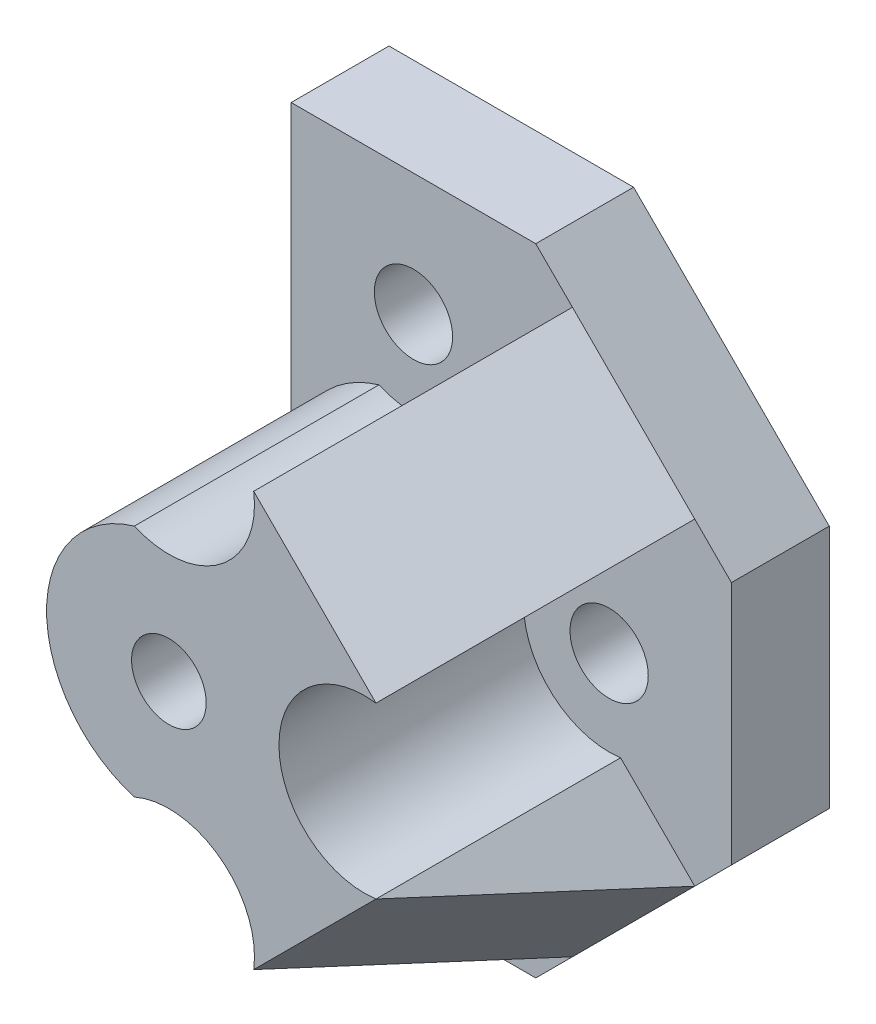
ISO-10303-21;
HEADER;
FILE_DESCRIPTION(('STEP AP214'),'2;1');
FILE_NAME('part.step','',(''),(''),'','','');
FILE_SCHEMA(('AUTOMOTIVE_DESIGN { 1 0 10303 214 1 1 1 1 }'));
ENDSEC;
DATA;
#1=APPLICATION_CONTEXT('core data for automotive mechanical design processes');
#2=APPLICATION_PROTOCOL_DEFINITION('international standard','automotive_design',2000,#1);
#3=PRODUCT_CONTEXT('',#1,'mechanical');
#4=PRODUCT('Part','Part','',(#3));
#5=PRODUCT_RELATED_PRODUCT_CATEGORY('part','',(#4));
#6=PRODUCT_DEFINITION_FORMATION('','',#4);
#7=PRODUCT_DEFINITION_CONTEXT('part definition',#1,'design');
#8=PRODUCT_DEFINITION('design','',#6,#7);
#9=PRODUCT_DEFINITION_SHAPE('','',#8);
#10=(LENGTH_UNIT() NAMED_UNIT(*) SI_UNIT(.MILLI.,.METRE.));
#11=(NAMED_UNIT(*) PLANE_ANGLE_UNIT() SI_UNIT($,.RADIAN.));
#12=(NAMED_UNIT(*) SI_UNIT($,.STERADIAN.) SOLID_ANGLE_UNIT());
#13=UNCERTAINTY_MEASURE_WITH_UNIT(LENGTH_MEASURE(1.E-05),#10,'distance_accuracy_value','');
#14=(GEOMETRIC_REPRESENTATION_CONTEXT(3) GLOBAL_UNCERTAINTY_ASSIGNED_CONTEXT((#13)) GLOBAL_UNIT_ASSIGNED_CONTEXT((#10,
#11,#12)) REPRESENTATION_CONTEXT('',''));
#15=CARTESIAN_POINT('',(0.,0.,0.));
#16=DIRECTION('',(0.,0.,1.));
#17=DIRECTION('',(1.,0.,0.));
#18=AXIS2_PLACEMENT_3D('',#15,#16,#17);
#19=CARTESIAN_POINT('',(0.,0.,4.));
#20=DIRECTION('',(0.,0.,-1.));
#21=DIRECTION('',(-1.,0.,0.));
#22=AXIS2_PLACEMENT_3D('',#19,#20,#21);
#23=PLANE('',#22);
#24=CARTESIAN_POINT('',(5.,5.,4.));
#25=DIRECTION('',(0.,0.,1.));
#26=DIRECTION('',(1.,0.,0.));
#27=AXIS2_PLACEMENT_3D('',#24,#25,#26);
#28=CIRCLE('',#27,1.6);
#29=CARTESIAN_POINT('',(6.6,5.,4.));
#30=VERTEX_POINT('',#29);
#31=EDGE_CURVE('E229',#30,#30,#28,.T.);
#32=ORIENTED_EDGE('',*,*,#31,.F.);
#33=EDGE_LOOP('',(#32));
#34=FACE_BOUND('',#33,.T.);
#35=DIRECTION('',(0.707106781186548,-0.707106781186547,0.));
#36=VECTOR('',#35,1.);
#37=CARTESIAN_POINT('',(8.46850196850295,4.53149803149705,4.));
#38=LINE('',#37,#36);
#39=CARTESIAN_POINT('',(8.46850196850295,4.53149803149705,4.));
#40=VERTEX_POINT('',#39);
#41=CARTESIAN_POINT('',(11.5,1.5,4.));
#42=VERTEX_POINT('',#41);
#43=EDGE_CURVE('E53',#40,#42,#38,.T.);
#44=ORIENTED_EDGE('',*,*,#43,.F.);
#45=CARTESIAN_POINT('',(5.,5.,4.));
#46=DIRECTION('',(0.,0.,-1.));
#47=DIRECTION('',(1.,0.,0.));
#48=AXIS2_PLACEMENT_3D('',#45,#46,#47);
#49=CIRCLE('',#48,3.5);
#50=CARTESIAN_POINT('',(3.58932986337166,8.203125,4.));
#51=VERTEX_POINT('',#50);
#52=EDGE_CURVE('E57',#51,#40,#49,.T.);
#53=ORIENTED_EDGE('',*,*,#52,.F.);
#54=CARTESIAN_POINT('',(5.,13.,4.));
#55=DIRECTION('',(0.,0.,1.));
#56=DIRECTION('',(1.,0.,0.));
#57=AXIS2_PLACEMENT_3D('',#54,#55,#56);
#58=CIRCLE('',#57,5.);
#59=CARTESIAN_POINT('',(0.,13.,4.));
#60=VERTEX_POINT('',#59);
#61=EDGE_CURVE('E11',#60,#51,#58,.T.);
#62=ORIENTED_EDGE('',*,*,#61,.F.);
#63=DIRECTION('',(0.,-1.,0.));
#64=VECTOR('',#63,1.);
#65=CARTESIAN_POINT('',(0.,0.,4.));
#66=LINE('',#65,#64);
#67=CARTESIAN_POINT('',(0.,0.,4.));
#68=VERTEX_POINT('',#67);
#69=EDGE_CURVE('E290',#60,#68,#66,.T.);
#70=ORIENTED_EDGE('',*,*,#69,.T.);
#71=DIRECTION('',(1.,0.,0.));
#72=VECTOR('',#71,1.);
#73=CARTESIAN_POINT('',(10.,0.,4.));
#74=LINE('',#73,#72);
#75=CARTESIAN_POINT('',(10.,0.,4.));
#76=VERTEX_POINT('',#75);
#77=EDGE_CURVE('E246',#68,#76,#74,.T.);
#78=ORIENTED_EDGE('',*,*,#77,.T.);
#79=DIRECTION('',(0.707106781186548,0.707106781186548,0.));
#80=VECTOR('',#79,1.);
#81=CARTESIAN_POINT('',(10.,0.,4.));
#82=LINE('',#81,#80);
#83=EDGE_CURVE('E257',#76,#42,#82,.T.);
#84=ORIENTED_EDGE('',*,*,#83,.T.);
#85=EDGE_LOOP('',(#44,#53,#62,#70,#78,#84));
#86=FACE_BOUND('',#85,.T.);
#87=ADVANCED_FACE('F35',(#34,#86),#23,.F.);
#88=CARTESIAN_POINT('',(5.,21.,4.));
#89=DIRECTION('',(0.,0.,1.));
#90=DIRECTION('',(1.,0.,0.));
#91=AXIS2_PLACEMENT_3D('',#88,#89,#90);
#92=CIRCLE('',#91,1.6);
#93=CARTESIAN_POINT('',(6.6,21.,4.));
#94=VERTEX_POINT('',#93);
#95=EDGE_CURVE('E240',#94,#94,#92,.T.);
#96=ORIENTED_EDGE('',*,*,#95,.F.);
#97=EDGE_LOOP('',(#96));
#98=FACE_BOUND('',#97,.T.);
#99=CARTESIAN_POINT('',(3.58932986337167,17.796875,4.));
#100=VERTEX_POINT('',#99);
#101=EDGE_CURVE('E46',#100,#60,#58,.T.);
#102=ORIENTED_EDGE('',*,*,#101,.F.);
#103=CARTESIAN_POINT('',(5.,21.,4.));
#104=DIRECTION('',(0.,0.,-1.));
#105=DIRECTION('',(1.,0.,0.));
#106=AXIS2_PLACEMENT_3D('',#103,#104,#105);
#107=CIRCLE('',#106,3.5);
#108=CARTESIAN_POINT('',(8.46850196850295,21.468501968503,4.));
#109=VERTEX_POINT('',#108);
#110=EDGE_CURVE('E192',#109,#100,#107,.T.);
#111=ORIENTED_EDGE('',*,*,#110,.F.);
#112=DIRECTION('',(-0.707106781186548,-0.707106781186547,0.));
#113=VECTOR('',#112,1.);
#114=CARTESIAN_POINT('',(11.5,24.5,4.));
#115=LINE('',#114,#113);
#116=CARTESIAN_POINT('',(11.5,24.5,4.));
#117=VERTEX_POINT('',#116);
#118=EDGE_CURVE('E196',#117,#109,#115,.T.);
#119=ORIENTED_EDGE('',*,*,#118,.F.);
#120=DIRECTION('',(-0.707106781186548,0.707106781186548,0.));
#121=VECTOR('',#120,1.);
#122=CARTESIAN_POINT('',(18.,18.,4.));
#123=LINE('',#122,#121);
#124=CARTESIAN_POINT('',(10.,26.,4.));
#125=VERTEX_POINT('',#124);
#126=EDGE_CURVE('E197',#117,#125,#123,.T.);
#127=ORIENTED_EDGE('',*,*,#126,.T.);
#128=DIRECTION('',(-1.,0.,0.));
#129=VECTOR('',#128,1.);
#130=CARTESIAN_POINT('',(0.,26.,4.));
#131=LINE('',#130,#129);
#132=CARTESIAN_POINT('',(0.,26.,4.));
#133=VERTEX_POINT('',#132);
#134=EDGE_CURVE('E291',#125,#133,#131,.T.);
#135=ORIENTED_EDGE('',*,*,#134,.T.);
#136=EDGE_CURVE('E276',#133,#60,#66,.T.);
#137=ORIENTED_EDGE('',*,*,#136,.T.);
#138=EDGE_LOOP('',(#102,#111,#119,#127,#135,#137));
#139=FACE_BOUND('',#138,.T.);
#140=ADVANCED_FACE('F349',(#98,#139),#23,.F.);
#141=CARTESIAN_POINT('',(13.,13.,4.));
#142=DIRECTION('',(0.,0.,1.));
#143=DIRECTION('',(1.,0.,0.));
#144=AXIS2_PLACEMENT_3D('',#141,#142,#143);
#145=CIRCLE('',#144,1.6);
#146=CARTESIAN_POINT('',(14.6,13.,4.));
#147=VERTEX_POINT('',#146);
#148=EDGE_CURVE('E222',#147,#147,#145,.T.);
#149=ORIENTED_EDGE('',*,*,#148,.F.);
#150=EDGE_LOOP('',(#149));
#151=FACE_BOUND('',#150,.T.);
#152=DIRECTION('',(-0.707106781186547,0.707106781186547,0.));
#153=VECTOR('',#152,1.);
#154=CARTESIAN_POINT('',(16.5,6.50000000000001,4.));
#155=LINE('',#154,#153);
#156=CARTESIAN_POINT('',(16.5,6.50000000000001,4.));
#157=VERTEX_POINT('',#156);
#158=CARTESIAN_POINT('',(13.468501968503,9.53149803149705,4.));
#159=VERTEX_POINT('',#158);
#160=EDGE_CURVE('E167',#157,#159,#155,.T.);
#161=ORIENTED_EDGE('',*,*,#160,.F.);
#162=CARTESIAN_POINT('',(18.,8.,4.));
#163=VERTEX_POINT('',#162);
#164=EDGE_CURVE('E249',#157,#163,#82,.T.);
#165=ORIENTED_EDGE('',*,*,#164,.T.);
#166=DIRECTION('',(0.,1.,0.));
#167=VECTOR('',#166,1.);
#168=CARTESIAN_POINT('',(18.,18.,4.));
#169=LINE('',#168,#167);
#170=CARTESIAN_POINT('',(18.,18.,4.));
#171=VERTEX_POINT('',#170);
#172=EDGE_CURVE('E253',#163,#171,#169,.T.);
#173=ORIENTED_EDGE('',*,*,#172,.T.);
#174=CARTESIAN_POINT('',(16.5,19.5,4.));
#175=VERTEX_POINT('',#174);
#176=EDGE_CURVE('E292',#171,#175,#123,.T.);
#177=ORIENTED_EDGE('',*,*,#176,.T.);
#178=DIRECTION('',(0.707106781186548,0.707106781186548,0.));
#179=VECTOR('',#178,1.);
#180=CARTESIAN_POINT('',(13.468501968503,16.468501968503,4.));
#181=LINE('',#180,#179);
#182=CARTESIAN_POINT('',(13.468501968503,16.468501968503,4.));
#183=VERTEX_POINT('',#182);
#184=EDGE_CURVE('E188',#183,#175,#181,.T.);
#185=ORIENTED_EDGE('',*,*,#184,.F.);
#186=CARTESIAN_POINT('',(13.,13.,4.));
#187=DIRECTION('',(0.,0.,-1.));
#188=DIRECTION('',(1.,0.,0.));
#189=AXIS2_PLACEMENT_3D('',#186,#187,#188);
#190=CIRCLE('',#189,3.5);
#191=EDGE_CURVE('E186',#159,#183,#190,.T.);
#192=ORIENTED_EDGE('',*,*,#191,.F.);
#193=EDGE_LOOP('',(#161,#165,#173,#177,#185,#192));
#194=FACE_BOUND('',#193,.T.);
#195=ADVANCED_FACE('F304',(#151,#194),#23,.F.);
#196=CARTESIAN_POINT('',(0.,0.,0.));
#197=DIRECTION('',(0.,0.,-1.));
#198=DIRECTION('',(-1.,0.,0.));
#199=AXIS2_PLACEMENT_3D('',#196,#197,#198);
#200=PLANE('',#199);
#201=CARTESIAN_POINT('',(5.,5.,0.));
#202=DIRECTION('',(0.,0.,1.));
#203=DIRECTION('',(1.,0.,0.));
#204=AXIS2_PLACEMENT_3D('',#201,#202,#203);
#205=CIRCLE('',#204,1.6);
#206=CARTESIAN_POINT('',(6.6,5.,0.));
#207=VERTEX_POINT('',#206);
#208=EDGE_CURVE('E225',#207,#207,#205,.T.);
#209=ORIENTED_EDGE('',*,*,#208,.T.);
#210=EDGE_LOOP('',(#209));
#211=FACE_BOUND('',#210,.T.);
#212=CARTESIAN_POINT('',(5.,21.,0.));
#213=DIRECTION('',(0.,0.,1.));
#214=DIRECTION('',(1.,0.,0.));
#215=AXIS2_PLACEMENT_3D('',#212,#213,#214);
#216=CIRCLE('',#215,1.6);
#217=CARTESIAN_POINT('',(6.6,21.,0.));
#218=VERTEX_POINT('',#217);
#219=EDGE_CURVE('E239',#218,#218,#216,.T.);
#220=ORIENTED_EDGE('',*,*,#219,.T.);
#221=EDGE_LOOP('',(#220));
#222=FACE_BOUND('',#221,.T.);
#223=DIRECTION('',(1.,0.,0.));
#224=VECTOR('',#223,1.);
#225=CARTESIAN_POINT('',(10.,0.,0.));
#226=LINE('',#225,#224);
#227=CARTESIAN_POINT('',(0.,0.,0.));
#228=VERTEX_POINT('',#227);
#229=CARTESIAN_POINT('',(10.,0.,0.));
#230=VERTEX_POINT('',#229);
#231=EDGE_CURVE('E243',#228,#230,#226,.T.);
#232=ORIENTED_EDGE('',*,*,#231,.F.);
#233=DIRECTION('',(0.,-1.,0.));
#234=VECTOR('',#233,1.);
#235=CARTESIAN_POINT('',(0.,0.,0.));
#236=LINE('',#235,#234);
#237=CARTESIAN_POINT('',(0.,26.,0.));
#238=VERTEX_POINT('',#237);
#239=EDGE_CURVE('E250',#238,#228,#236,.T.);
#240=ORIENTED_EDGE('',*,*,#239,.F.);
#241=DIRECTION('',(-1.,0.,0.));
#242=VECTOR('',#241,1.);
#243=CARTESIAN_POINT('',(0.,26.,0.));
#244=LINE('',#243,#242);
#245=CARTESIAN_POINT('',(10.,26.,0.));
#246=VERTEX_POINT('',#245);
#247=EDGE_CURVE('E278',#246,#238,#244,.T.);
#248=ORIENTED_EDGE('',*,*,#247,.F.);
#249=DIRECTION('',(-0.707106781186548,0.707106781186548,0.));
#250=VECTOR('',#249,1.);
#251=CARTESIAN_POINT('',(18.,18.,0.));
#252=LINE('',#251,#250);
#253=CARTESIAN_POINT('',(18.,18.,0.));
#254=VERTEX_POINT('',#253);
#255=EDGE_CURVE('E280',#254,#246,#252,.T.);
#256=ORIENTED_EDGE('',*,*,#255,.F.);
#257=DIRECTION('',(0.,1.,0.));
#258=VECTOR('',#257,1.);
#259=CARTESIAN_POINT('',(18.,18.,0.));
#260=LINE('',#259,#258);
#261=CARTESIAN_POINT('',(18.,8.,0.));
#262=VERTEX_POINT('',#261);
#263=EDGE_CURVE('E282',#262,#254,#260,.T.);
#264=ORIENTED_EDGE('',*,*,#263,.F.);
#265=DIRECTION('',(0.707106781186548,0.707106781186548,0.));
#266=VECTOR('',#265,1.);
#267=CARTESIAN_POINT('',(10.,0.,0.));
#268=LINE('',#267,#266);
#269=EDGE_CURVE('E284',#230,#262,#268,.T.);
#270=ORIENTED_EDGE('',*,*,#269,.F.);
#271=EDGE_LOOP('',(#232,#240,#248,#256,#264,#270));
#272=FACE_BOUND('',#271,.T.);
#273=CARTESIAN_POINT('',(5.,13.,0.));
#274=DIRECTION('',(0.,0.,1.));
#275=DIRECTION('',(1.,0.,0.));
#276=AXIS2_PLACEMENT_3D('',#273,#274,#275);
#277=CIRCLE('',#276,3.2);
#278=CARTESIAN_POINT('',(8.2,13.,0.));
#279=VERTEX_POINT('',#278);
#280=EDGE_CURVE('E232',#279,#279,#277,.T.);
#281=ORIENTED_EDGE('',*,*,#280,.T.);
#282=EDGE_LOOP('',(#281));
#283=FACE_BOUND('',#282,.T.);
#284=CARTESIAN_POINT('',(13.,13.,0.));
#285=DIRECTION('',(0.,0.,1.));
#286=DIRECTION('',(1.,0.,0.));
#287=AXIS2_PLACEMENT_3D('',#284,#285,#286);
#288=CIRCLE('',#287,1.6);
#289=CARTESIAN_POINT('',(14.6,13.,0.));
#290=VERTEX_POINT('',#289);
#291=EDGE_CURVE('E226',#290,#290,#288,.T.);
#292=ORIENTED_EDGE('',*,*,#291,.T.);
#293=EDGE_LOOP('',(#292));
#294=FACE_BOUND('',#293,.T.);
#295=ADVANCED_FACE('F360',(#211,#222,#272,#283,#294),#200,.T.);
#296=CARTESIAN_POINT('',(10.,0.,4.));
#297=DIRECTION('',(0.,1.,0.));
#298=DIRECTION('',(0.,0.,1.));
#299=AXIS2_PLACEMENT_3D('',#296,#297,#298);
#300=PLANE('',#299);
#301=ORIENTED_EDGE('',*,*,#231,.T.);
#302=DIRECTION('',(0.,0.,-1.));
#303=VECTOR('',#302,1.);
#304=CARTESIAN_POINT('',(10.,0.,4.));
#305=LINE('',#304,#303);
#306=EDGE_CURVE('E44',#76,#230,#305,.T.);
#307=ORIENTED_EDGE('',*,*,#306,.F.);
#308=ORIENTED_EDGE('',*,*,#77,.F.);
#309=DIRECTION('',(0.,0.,-1.));
#310=VECTOR('',#309,1.);
#311=CARTESIAN_POINT('',(0.,0.,4.));
#312=LINE('',#311,#310);
#313=EDGE_CURVE('E273',#68,#228,#312,.T.);
#314=ORIENTED_EDGE('',*,*,#313,.T.);
#315=EDGE_LOOP('',(#301,#307,#308,#314));
#316=FACE_BOUND('',#315,.T.);
#317=ADVANCED_FACE('F37',(#316),#300,.F.);
#318=CARTESIAN_POINT('',(10.,0.,4.));
#319=DIRECTION('',(-0.707106781186548,0.707106781186547,0.));
#320=DIRECTION('',(-0.707106781186547,-0.707106781186548,0.));
#321=AXIS2_PLACEMENT_3D('',#318,#319,#320);
#322=PLANE('',#321);
#323=ORIENTED_EDGE('',*,*,#164,.F.);
#324=DIRECTION('',(0.707106781186547,0.707106781186548,0.));
#325=VECTOR('',#324,1.);
#326=CARTESIAN_POINT('',(9.42893218813453,-0.571067811865475,4.));
#327=LINE('',#326,#325);
#328=EDGE_CURVE('E145',#42,#157,#327,.T.);
#329=ORIENTED_EDGE('',*,*,#328,.F.);
#330=ORIENTED_EDGE('',*,*,#83,.F.);
#331=ORIENTED_EDGE('',*,*,#306,.T.);
#332=ORIENTED_EDGE('',*,*,#269,.T.);
#333=DIRECTION('',(0.,0.,-1.));
#334=VECTOR('',#333,1.);
#335=CARTESIAN_POINT('',(18.,8.,4.));
#336=LINE('',#335,#334);
#337=EDGE_CURVE('E261',#163,#262,#336,.T.);
#338=ORIENTED_EDGE('',*,*,#337,.F.);
#339=EDGE_LOOP('',(#323,#329,#330,#331,#332,#338));
#340=FACE_BOUND('',#339,.T.);
#341=ADVANCED_FACE('F435',(#340),#322,.F.);
#342=CARTESIAN_POINT('',(18.,18.,4.));
#343=DIRECTION('',(-1.,0.,0.));
#344=DIRECTION('',(0.,0.,1.));
#345=AXIS2_PLACEMENT_3D('',#342,#343,#344);
#346=PLANE('',#345);
#347=ORIENTED_EDGE('',*,*,#263,.T.);
#348=DIRECTION('',(0.,0.,-1.));
#349=VECTOR('',#348,1.);
#350=CARTESIAN_POINT('',(18.,18.,4.));
#351=LINE('',#350,#349);
#352=EDGE_CURVE('E264',#171,#254,#351,.T.);
#353=ORIENTED_EDGE('',*,*,#352,.F.);
#354=ORIENTED_EDGE('',*,*,#172,.F.);
#355=ORIENTED_EDGE('',*,*,#337,.T.);
#356=EDGE_LOOP('',(#347,#353,#354,#355));
#357=FACE_BOUND('',#356,.T.);
#358=ADVANCED_FACE('F308',(#357),#346,.F.);
#359=CARTESIAN_POINT('',(18.,18.,4.));
#360=DIRECTION('',(-0.707106781186548,-0.707106781186547,0.));
#361=DIRECTION('',(0.707106781186547,-0.707106781186548,0.));
#362=AXIS2_PLACEMENT_3D('',#359,#360,#361);
#363=PLANE('',#362);
#364=ORIENTED_EDGE('',*,*,#126,.F.);
#365=DIRECTION('',(0.707106781186548,-0.707106781186547,0.));
#366=VECTOR('',#365,1.);
#367=CARTESIAN_POINT('',(9.42893218813452,26.5710678118655,4.));
#368=LINE('',#367,#366);
#369=EDGE_CURVE('E314',#117,#175,#368,.T.);
#370=ORIENTED_EDGE('',*,*,#369,.T.);
#371=ORIENTED_EDGE('',*,*,#176,.F.);
#372=ORIENTED_EDGE('',*,*,#352,.T.);
#373=ORIENTED_EDGE('',*,*,#255,.T.);
#374=DIRECTION('',(0.,0.,-1.));
#375=VECTOR('',#374,1.);
#376=CARTESIAN_POINT('',(10.,26.,4.));
#377=LINE('',#376,#375);
#378=EDGE_CURVE('E267',#125,#246,#377,.T.);
#379=ORIENTED_EDGE('',*,*,#378,.F.);
#380=EDGE_LOOP('',(#364,#370,#371,#372,#373,#379));
#381=FACE_BOUND('',#380,.T.);
#382=ADVANCED_FACE('F313',(#381),#363,.F.);
#383=CARTESIAN_POINT('',(0.,26.,4.));
#384=DIRECTION('',(0.,-1.,0.));
#385=DIRECTION('',(0.,0.,-1.));
#386=AXIS2_PLACEMENT_3D('',#383,#384,#385);
#387=PLANE('',#386);
#388=ORIENTED_EDGE('',*,*,#247,.T.);
#389=DIRECTION('',(0.,0.,-1.));
#390=VECTOR('',#389,1.);
#391=CARTESIAN_POINT('',(0.,26.,4.));
#392=LINE('',#391,#390);
#393=EDGE_CURVE('E270',#133,#238,#392,.T.);
#394=ORIENTED_EDGE('',*,*,#393,.F.);
#395=ORIENTED_EDGE('',*,*,#134,.F.);
#396=ORIENTED_EDGE('',*,*,#378,.T.);
#397=EDGE_LOOP('',(#388,#394,#395,#396));
#398=FACE_BOUND('',#397,.T.);
#399=ADVANCED_FACE('F394',(#398),#387,.F.);
#400=CARTESIAN_POINT('',(0.,0.,4.));
#401=DIRECTION('',(1.,0.,0.));
#402=DIRECTION('',(0.,0.,-1.));
#403=AXIS2_PLACEMENT_3D('',#400,#401,#402);
#404=PLANE('',#403);
#405=ORIENTED_EDGE('',*,*,#239,.T.);
#406=ORIENTED_EDGE('',*,*,#313,.F.);
#407=ORIENTED_EDGE('',*,*,#69,.F.);
#408=ORIENTED_EDGE('',*,*,#136,.F.);
#409=ORIENTED_EDGE('',*,*,#393,.T.);
#410=EDGE_LOOP('',(#405,#406,#407,#408,#409));
#411=FACE_BOUND('',#410,.T.);
#412=ADVANCED_FACE('F389',(#411),#404,.F.);
#413=CARTESIAN_POINT('',(5.,21.,4.));
#414=DIRECTION('',(0.,0.,-1.));
#415=DIRECTION('',(-1.,0.,0.));
#416=AXIS2_PLACEMENT_3D('',#413,#414,#415);
#417=CYLINDRICAL_SURFACE('',#416,1.6);
#418=ORIENTED_EDGE('',*,*,#95,.T.);
#419=EDGE_LOOP('',(#418));
#420=FACE_BOUND('',#419,.T.);
#421=ORIENTED_EDGE('',*,*,#219,.F.);
#422=EDGE_LOOP('',(#421));
#423=FACE_BOUND('',#422,.T.);
#424=ADVANCED_FACE('F386',(#420,#423),#417,.F.);
#425=CARTESIAN_POINT('',(5.,13.,4.));
#426=DIRECTION('',(0.,0.,-1.));
#427=DIRECTION('',(-1.,0.,0.));
#428=AXIS2_PLACEMENT_3D('',#425,#426,#427);
#429=CYLINDRICAL_SURFACE('',#428,3.2);
#430=CARTESIAN_POINT('',(5.,13.,4.));
#431=DIRECTION('',(0.,0.,1.));
#432=DIRECTION('',(1.,0.,0.));
#433=AXIS2_PLACEMENT_3D('',#430,#431,#432);
#434=CIRCLE('',#433,3.2);
#435=CARTESIAN_POINT('',(8.2,13.,4.));
#436=VERTEX_POINT('',#435);
#437=EDGE_CURVE('E221',#436,#436,#434,.T.);
#438=ORIENTED_EDGE('',*,*,#437,.T.);
#439=EDGE_LOOP('',(#438));
#440=FACE_BOUND('',#439,.T.);
#441=ORIENTED_EDGE('',*,*,#280,.F.);
#442=EDGE_LOOP('',(#441));
#443=FACE_BOUND('',#442,.T.);
#444=ADVANCED_FACE('F379',(#440,#443),#429,.F.);
#445=CARTESIAN_POINT('',(5.,5.,4.));
#446=DIRECTION('',(0.,0.,-1.));
#447=DIRECTION('',(-1.,0.,0.));
#448=AXIS2_PLACEMENT_3D('',#445,#446,#447);
#449=CYLINDRICAL_SURFACE('',#448,1.6);
#450=ORIENTED_EDGE('',*,*,#31,.T.);
#451=EDGE_LOOP('',(#450));
#452=FACE_BOUND('',#451,.T.);
#453=ORIENTED_EDGE('',*,*,#208,.F.);
#454=EDGE_LOOP('',(#453));
#455=FACE_BOUND('',#454,.T.);
#456=ADVANCED_FACE('F371',(#452,#455),#449,.F.);
#457=CARTESIAN_POINT('',(13.,13.,4.));
#458=DIRECTION('',(0.,0.,-1.));
#459=DIRECTION('',(-1.,0.,0.));
#460=AXIS2_PLACEMENT_3D('',#457,#458,#459);
#461=CYLINDRICAL_SURFACE('',#460,1.6);
#462=ORIENTED_EDGE('',*,*,#148,.T.);
#463=EDGE_LOOP('',(#462));
#464=FACE_BOUND('',#463,.T.);
#465=ORIENTED_EDGE('',*,*,#291,.F.);
#466=EDGE_LOOP('',(#465));
#467=FACE_BOUND('',#466,.T.);
#468=ADVANCED_FACE('F368',(#464,#467),#461,.F.);
#469=CARTESIAN_POINT('',(13.,13.,14.));
#470=DIRECTION('',(0.,0.,1.));
#471=DIRECTION('',(1.,0.,0.));
#472=AXIS2_PLACEMENT_3D('',#469,#470,#471);
#473=PLANE('',#472);
#474=DIRECTION('',(0.707106781186547,0.707106781186548,0.));
#475=VECTOR('',#474,1.);
#476=CARTESIAN_POINT('',(6.39743415663748,2.46043021963157,14.));
#477=LINE('',#476,#475);
#478=CARTESIAN_POINT('',(8.46850196850295,4.53149803149705,14.));
#479=VERTEX_POINT('',#478);
#480=CARTESIAN_POINT('',(13.468501968503,9.53149803149705,14.));
#481=VERTEX_POINT('',#480);
#482=EDGE_CURVE('E142',#479,#481,#477,.T.);
#483=ORIENTED_EDGE('',*,*,#482,.T.);
#484=CARTESIAN_POINT('',(13.,13.,14.));
#485=DIRECTION('',(0.,0.,-1.));
#486=DIRECTION('',(1.,0.,0.));
#487=AXIS2_PLACEMENT_3D('',#484,#485,#486);
#488=CIRCLE('',#487,3.5);
#489=CARTESIAN_POINT('',(13.468501968503,16.468501968503,14.));
#490=VERTEX_POINT('',#489);
#491=EDGE_CURVE('E157',#481,#490,#488,.T.);
#492=ORIENTED_EDGE('',*,*,#491,.T.);
#493=DIRECTION('',(0.707106781186548,-0.707106781186547,0.));
#494=VECTOR('',#493,1.);
#495=CARTESIAN_POINT('',(6.39743415663747,23.5395697803684,14.));
#496=LINE('',#495,#494);
#497=CARTESIAN_POINT('',(8.46850196850295,21.4685019685029,14.));
#498=VERTEX_POINT('',#497);
#499=EDGE_CURVE('E317',#498,#490,#496,.T.);
#500=ORIENTED_EDGE('',*,*,#499,.F.);
#501=CARTESIAN_POINT('',(5.,21.,14.));
#502=DIRECTION('',(0.,0.,-1.));
#503=DIRECTION('',(1.,0.,0.));
#504=AXIS2_PLACEMENT_3D('',#501,#502,#503);
#505=CIRCLE('',#504,3.5);
#506=CARTESIAN_POINT('',(3.58932986337167,17.796875,14.));
#507=VERTEX_POINT('',#506);
#508=EDGE_CURVE('E175',#498,#507,#505,.T.);
#509=ORIENTED_EDGE('',*,*,#508,.T.);
#510=CARTESIAN_POINT('',(5.,13.,14.));
#511=DIRECTION('',(0.,0.,1.));
#512=DIRECTION('',(1.,0.,0.));
#513=AXIS2_PLACEMENT_3D('',#510,#511,#512);
#514=CIRCLE('',#513,5.);
#515=CARTESIAN_POINT('',(3.58932986337166,8.203125,14.));
#516=VERTEX_POINT('',#515);
#517=EDGE_CURVE('E177',#507,#516,#514,.T.);
#518=ORIENTED_EDGE('',*,*,#517,.T.);
#519=CARTESIAN_POINT('',(5.,5.,14.));
#520=DIRECTION('',(0.,0.,-1.));
#521=DIRECTION('',(1.,0.,0.));
#522=AXIS2_PLACEMENT_3D('',#519,#520,#521);
#523=CIRCLE('',#522,3.5);
#524=EDGE_CURVE('E160',#516,#479,#523,.T.);
#525=ORIENTED_EDGE('',*,*,#524,.T.);
#526=EDGE_LOOP('',(#483,#492,#500,#509,#518,#525));
#527=FACE_BOUND('',#526,.T.);
#528=CARTESIAN_POINT('',(5.,13.,14.));
#529=DIRECTION('',(0.,0.,1.));
#530=DIRECTION('',(1.,0.,0.));
#531=AXIS2_PLACEMENT_3D('',#528,#529,#530);
#532=CIRCLE('',#531,1.525);
#533=CARTESIAN_POINT('',(6.525,13.,14.));
#534=VERTEX_POINT('',#533);
#535=EDGE_CURVE('E189',#534,#534,#532,.T.);
#536=ORIENTED_EDGE('',*,*,#535,.F.);
#537=EDGE_LOOP('',(#536));
#538=FACE_BOUND('',#537,.T.);
#539=ADVANCED_FACE('F153',(#527,#538),#473,.T.);
#540=CARTESIAN_POINT('',(13.,13.,4.));
#541=DIRECTION('',(0.,0.,1.));
#542=DIRECTION('',(1.,0.,0.));
#543=AXIS2_PLACEMENT_3D('',#540,#541,#542);
#544=PLANE('',#543);
#545=ORIENTED_EDGE('',*,*,#437,.F.);
#546=EDGE_LOOP('',(#545));
#547=FACE_BOUND('',#546,.T.);
#548=CARTESIAN_POINT('',(5.,13.,4.));
#549=DIRECTION('',(0.,0.,1.));
#550=DIRECTION('',(1.,0.,0.));
#551=AXIS2_PLACEMENT_3D('',#548,#549,#550);
#552=CIRCLE('',#551,1.525);
#553=CARTESIAN_POINT('',(6.525,13.,4.));
#554=VERTEX_POINT('',#553);
#555=EDGE_CURVE('E181',#554,#554,#552,.T.);
#556=ORIENTED_EDGE('',*,*,#555,.T.);
#557=EDGE_LOOP('',(#556));
#558=FACE_BOUND('',#557,.T.);
#559=ADVANCED_FACE('F334',(#547,#558),#544,.F.);
#560=CARTESIAN_POINT('',(13.,13.,14.));
#561=DIRECTION('',(0.,0.,-1.));
#562=DIRECTION('',(-1.,0.,0.));
#563=AXIS2_PLACEMENT_3D('',#560,#561,#562);
#564=CYLINDRICAL_SURFACE('',#563,3.5);
#565=ORIENTED_EDGE('',*,*,#191,.T.);
#566=DIRECTION('',(0.,0.,-1.));
#567=VECTOR('',#566,1.);
#568=CARTESIAN_POINT('',(13.468501968503,16.468501968503,14.));
#569=LINE('',#568,#567);
#570=EDGE_CURVE('E174',#490,#183,#569,.T.);
#571=ORIENTED_EDGE('',*,*,#570,.F.);
#572=ORIENTED_EDGE('',*,*,#491,.F.);
#573=DIRECTION('',(0.,0.,-1.));
#574=VECTOR('',#573,1.);
#575=CARTESIAN_POINT('',(13.468501968503,9.53149803149705,14.));
#576=LINE('',#575,#574);
#577=EDGE_CURVE('E165',#481,#159,#576,.T.);
#578=ORIENTED_EDGE('',*,*,#577,.T.);
#579=EDGE_LOOP('',(#565,#571,#572,#578));
#580=FACE_BOUND('',#579,.T.);
#581=ADVANCED_FACE('F172',(#580),#564,.F.);
#582=CARTESIAN_POINT('',(13.468501968503,16.468501968503,14.));
#583=DIRECTION('',(-0.707106781186548,0.707106781186548,0.));
#584=DIRECTION('',(-0.707106781186548,-0.707106781186548,0.));
#585=AXIS2_PLACEMENT_3D('',#582,#583,#584);
#586=PLANE('',#585);
#587=ORIENTED_EDGE('',*,*,#184,.T.);
#588=DIRECTION('',(0.278623789686718,0.278623789686718,-0.919096060072734));
#589=VECTOR('',#588,1.);
#590=CARTESIAN_POINT('',(13.468501968503,16.468501968503,14.));
#591=LINE('',#590,#589);
#592=EDGE_CURVE('E318',#490,#175,#591,.T.);
#593=ORIENTED_EDGE('',*,*,#592,.F.);
#594=ORIENTED_EDGE('',*,*,#570,.T.);
#595=EDGE_LOOP('',(#587,#593,#594));
#596=FACE_BOUND('',#595,.T.);
#597=ADVANCED_FACE('F433',(#596),#586,.F.);
#598=CARTESIAN_POINT('',(11.5,24.5,14.));
#599=DIRECTION('',(0.707106781186547,-0.707106781186548,0.));
#600=DIRECTION('',(0.707106781186548,0.707106781186547,0.));
#601=AXIS2_PLACEMENT_3D('',#598,#599,#600);
#602=PLANE('',#601);
#603=DIRECTION('',(0.,0.,-1.));
#604=VECTOR('',#603,1.);
#605=CARTESIAN_POINT('',(8.46850196850295,21.468501968503,14.));
#606=LINE('',#605,#604);
#607=EDGE_CURVE('E217',#498,#109,#606,.T.);
#608=ORIENTED_EDGE('',*,*,#607,.F.);
#609=DIRECTION('',(0.278623789686718,0.278623789686718,-0.919096060072734));
#610=VECTOR('',#609,1.);
#611=CARTESIAN_POINT('',(8.93917972656403,21.939179726564,12.4473756764122));
#612=LINE('',#611,#610);
#613=EDGE_CURVE('E320',#498,#117,#612,.T.);
#614=ORIENTED_EDGE('',*,*,#613,.T.);
#615=ORIENTED_EDGE('',*,*,#118,.T.);
#616=EDGE_LOOP('',(#608,#614,#615));
#617=FACE_BOUND('',#616,.T.);
#618=ADVANCED_FACE('F428',(#617),#602,.F.);
#619=CARTESIAN_POINT('',(5.,21.,14.));
#620=DIRECTION('',(0.,0.,-1.));
#621=DIRECTION('',(-1.,0.,0.));
#622=AXIS2_PLACEMENT_3D('',#619,#620,#621);
#623=CYLINDRICAL_SURFACE('',#622,3.5);
#624=ORIENTED_EDGE('',*,*,#110,.T.);
#625=DIRECTION('',(0.,0.,-1.));
#626=VECTOR('',#625,1.);
#627=CARTESIAN_POINT('',(3.58932986337167,17.796875,14.));
#628=LINE('',#627,#626);
#629=EDGE_CURVE('E214',#507,#100,#628,.T.);
#630=ORIENTED_EDGE('',*,*,#629,.F.);
#631=ORIENTED_EDGE('',*,*,#508,.F.);
#632=ORIENTED_EDGE('',*,*,#607,.T.);
#633=EDGE_LOOP('',(#624,#630,#631,#632));
#634=FACE_BOUND('',#633,.T.);
#635=ADVANCED_FACE('F430',(#634),#623,.F.);
#636=CARTESIAN_POINT('',(5.,13.,14.));
#637=DIRECTION('',(0.,0.,-1.));
#638=DIRECTION('',(-1.,0.,0.));
#639=AXIS2_PLACEMENT_3D('',#636,#637,#638);
#640=CYLINDRICAL_SURFACE('',#639,5.);
#641=ORIENTED_EDGE('',*,*,#101,.T.);
#642=ORIENTED_EDGE('',*,*,#61,.T.);
#643=DIRECTION('',(0.,0.,-1.));
#644=VECTOR('',#643,1.);
#645=CARTESIAN_POINT('',(3.58932986337166,8.203125,14.));
#646=LINE('',#645,#644);
#647=EDGE_CURVE('E211',#516,#51,#646,.T.);
#648=ORIENTED_EDGE('',*,*,#647,.F.);
#649=ORIENTED_EDGE('',*,*,#517,.F.);
#650=ORIENTED_EDGE('',*,*,#629,.T.);
#651=EDGE_LOOP('',(#641,#642,#648,#649,#650));
#652=FACE_BOUND('',#651,.T.);
#653=ADVANCED_FACE('F420',(#652),#640,.T.);
#654=CARTESIAN_POINT('',(5.,5.,14.));
#655=DIRECTION('',(0.,0.,-1.));
#656=DIRECTION('',(-1.,0.,0.));
#657=AXIS2_PLACEMENT_3D('',#654,#655,#656);
#658=CYLINDRICAL_SURFACE('',#657,3.5);
#659=ORIENTED_EDGE('',*,*,#52,.T.);
#660=DIRECTION('',(0.,0.,-1.));
#661=VECTOR('',#660,1.);
#662=CARTESIAN_POINT('',(8.46850196850295,4.53149803149705,14.));
#663=LINE('',#662,#661);
#664=EDGE_CURVE('E170',#479,#40,#663,.T.);
#665=ORIENTED_EDGE('',*,*,#664,.F.);
#666=ORIENTED_EDGE('',*,*,#524,.F.);
#667=ORIENTED_EDGE('',*,*,#647,.T.);
#668=EDGE_LOOP('',(#659,#665,#666,#667));
#669=FACE_BOUND('',#668,.T.);
#670=ADVANCED_FACE('F438',(#669),#658,.F.);
#671=CARTESIAN_POINT('',(8.46850196850295,4.53149803149705,14.));
#672=DIRECTION('',(0.707106781186547,0.707106781186548,0.));
#673=DIRECTION('',(-0.707106781186548,0.707106781186547,0.));
#674=AXIS2_PLACEMENT_3D('',#671,#672,#673);
#675=PLANE('',#674);
#676=ORIENTED_EDGE('',*,*,#43,.T.);
#677=DIRECTION('',(-0.278623789686719,0.278623789686719,0.919096060072734));
#678=VECTOR('',#677,1.);
#679=CARTESIAN_POINT('',(8.46850196850295,4.53149803149705,14.));
#680=LINE('',#679,#678);
#681=EDGE_CURVE('E162',#42,#479,#680,.T.);
#682=ORIENTED_EDGE('',*,*,#681,.T.);
#683=ORIENTED_EDGE('',*,*,#664,.T.);
#684=EDGE_LOOP('',(#676,#682,#683));
#685=FACE_BOUND('',#684,.T.);
#686=ADVANCED_FACE('F345',(#685),#675,.F.);
#687=CARTESIAN_POINT('',(16.5,6.50000000000001,14.));
#688=DIRECTION('',(-0.707106781186548,-0.707106781186548,0.));
#689=DIRECTION('',(0.707106781186548,-0.707106781186548,0.));
#690=AXIS2_PLACEMENT_3D('',#687,#688,#689);
#691=PLANE('',#690);
#692=ORIENTED_EDGE('',*,*,#577,.F.);
#693=DIRECTION('',(-0.278623789686719,0.278623789686719,0.919096060072734));
#694=VECTOR('',#693,1.);
#695=CARTESIAN_POINT('',(16.5,6.5,4.));
#696=LINE('',#695,#694);
#697=EDGE_CURVE('E139',#157,#481,#696,.T.);
#698=ORIENTED_EDGE('',*,*,#697,.F.);
#699=ORIENTED_EDGE('',*,*,#160,.T.);
#700=EDGE_LOOP('',(#692,#698,#699));
#701=FACE_BOUND('',#700,.T.);
#702=ADVANCED_FACE('F166',(#701),#691,.F.);
#703=CARTESIAN_POINT('',(5.,13.,14.));
#704=DIRECTION('',(0.,0.,-1.));
#705=DIRECTION('',(-1.,0.,0.));
#706=AXIS2_PLACEMENT_3D('',#703,#704,#705);
#707=CYLINDRICAL_SURFACE('',#706,1.525);
#708=ORIENTED_EDGE('',*,*,#535,.T.);
#709=EDGE_LOOP('',(#708));
#710=FACE_BOUND('',#709,.T.);
#711=ORIENTED_EDGE('',*,*,#555,.F.);
#712=EDGE_LOOP('',(#711));
#713=FACE_BOUND('',#712,.T.);
#714=ADVANCED_FACE('F336',(#710,#713),#707,.F.);
#715=CARTESIAN_POINT('',(6.39743415663747,23.5395697803684,14.));
#716=DIRECTION('',(-0.649899056639269,-0.649899056639269,-0.394033542174746));
#717=DIRECTION('',(0.707106781186548,-0.707106781186547,0.));
#718=AXIS2_PLACEMENT_3D('',#715,#716,#717);
#719=PLANE('',#718);
#720=ORIENTED_EDGE('',*,*,#499,.T.);
#721=ORIENTED_EDGE('',*,*,#592,.T.);
#722=ORIENTED_EDGE('',*,*,#369,.F.);
#723=ORIENTED_EDGE('',*,*,#613,.F.);
#724=EDGE_LOOP('',(#720,#721,#722,#723));
#725=FACE_BOUND('',#724,.T.);
#726=ADVANCED_FACE('F338',(#725),#719,.F.);
#727=CARTESIAN_POINT('',(9.42893218813453,-0.571067811865475,4.));
#728=DIRECTION('',(-0.649899056639269,0.649899056639268,-0.394033542174747));
#729=DIRECTION('',(-0.707106781186547,-0.707106781186548,0.));
#730=AXIS2_PLACEMENT_3D('',#727,#728,#729);
#731=PLANE('',#730);
#732=ORIENTED_EDGE('',*,*,#328,.T.);
#733=ORIENTED_EDGE('',*,*,#697,.T.);
#734=ORIENTED_EDGE('',*,*,#482,.F.);
#735=ORIENTED_EDGE('',*,*,#681,.F.);
#736=EDGE_LOOP('',(#732,#733,#734,#735));
#737=FACE_BOUND('',#736,.T.);
#738=ADVANCED_FACE('F141',(#737),#731,.F.);
#739=CLOSED_SHELL('',(#87,#140,#195,#295,#317,#341,#358,#382,#399,#412,#424,#444,#456,#468,#539,
#559,#581,#597,#618,#635,#653,#670,#686,#702,#714,#726,#738));
#740=MANIFOLD_SOLID_BREP('B2',#739);
#741=ADVANCED_BREP_SHAPE_REPRESENTATION('',(#18,#740),#14);
#742=SHAPE_DEFINITION_REPRESENTATION(#9,#741);
ENDSEC;
END-ISO-10303-21;
